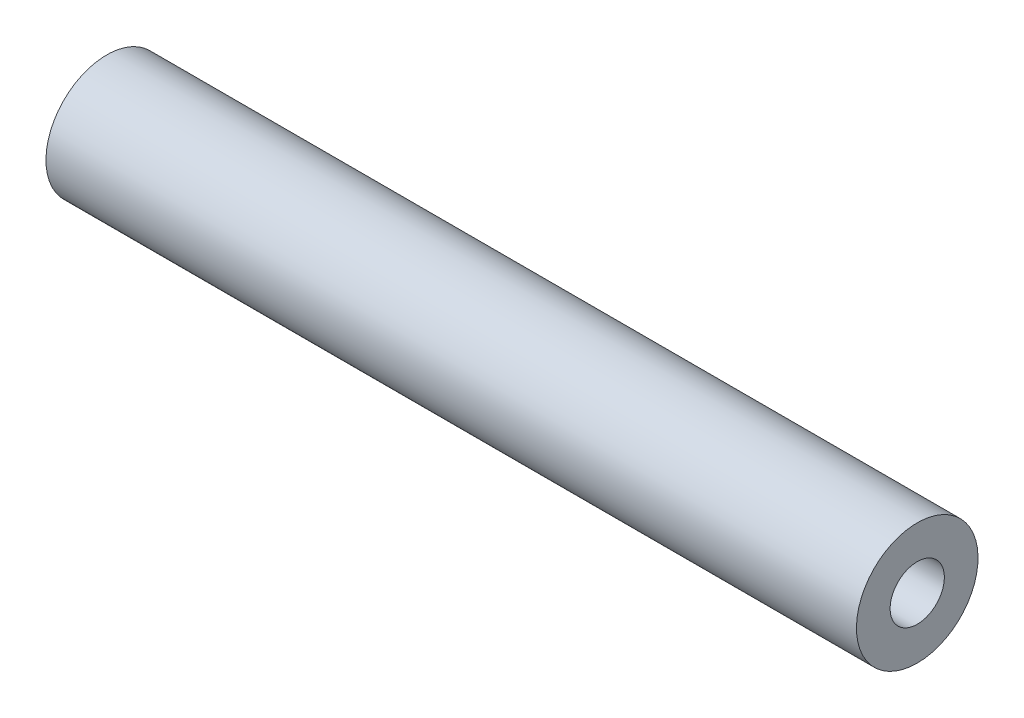
ISO-10303-21;
HEADER;
FILE_DESCRIPTION(('STEP AP214'),'2;1');
FILE_NAME('part.step','',(''),(''),'','','');
FILE_SCHEMA(('AUTOMOTIVE_DESIGN { 1 0 10303 214 1 1 1 1 }'));
ENDSEC;
DATA;
#1=APPLICATION_CONTEXT('core data for automotive mechanical design processes');
#2=APPLICATION_PROTOCOL_DEFINITION('international standard','automotive_design',2000,#1);
#3=PRODUCT_CONTEXT('',#1,'mechanical');
#4=PRODUCT('Part','Part','',(#3));
#5=PRODUCT_RELATED_PRODUCT_CATEGORY('part','',(#4));
#6=PRODUCT_DEFINITION_FORMATION('','',#4);
#7=PRODUCT_DEFINITION_CONTEXT('part definition',#1,'design');
#8=PRODUCT_DEFINITION('design','',#6,#7);
#9=PRODUCT_DEFINITION_SHAPE('','',#8);
#10=(LENGTH_UNIT() NAMED_UNIT(*) SI_UNIT(.MILLI.,.METRE.));
#11=(NAMED_UNIT(*) PLANE_ANGLE_UNIT() SI_UNIT($,.RADIAN.));
#12=(NAMED_UNIT(*) SI_UNIT($,.STERADIAN.) SOLID_ANGLE_UNIT());
#13=UNCERTAINTY_MEASURE_WITH_UNIT(LENGTH_MEASURE(1.E-05),#10,'distance_accuracy_value','');
#14=(GEOMETRIC_REPRESENTATION_CONTEXT(3) GLOBAL_UNCERTAINTY_ASSIGNED_CONTEXT((#13)) GLOBAL_UNIT_ASSIGNED_CONTEXT((#10,
#11,#12)) REPRESENTATION_CONTEXT('',''));
#15=CARTESIAN_POINT('',(0.,0.,0.));
#16=DIRECTION('',(0.,0.,1.));
#17=DIRECTION('',(1.,0.,0.));
#18=AXIS2_PLACEMENT_3D('',#15,#16,#17);
#19=CARTESIAN_POINT('',(0.,0.,0.));
#20=DIRECTION('',(-1.,0.,0.));
#21=DIRECTION('',(0.,-1.,0.));
#22=AXIS2_PLACEMENT_3D('',#19,#20,#21);
#23=PLANE('',#22);
#24=CARTESIAN_POINT('',(0.,3.80999999999999,0.));
#25=DIRECTION('',(-1.,0.,0.));
#26=DIRECTION('',(0.,0.,1.));
#27=AXIS2_PLACEMENT_3D('',#24,#25,#26);
#28=CIRCLE('',#27,1.69999999999999);
#29=CARTESIAN_POINT('',(0.,3.80999999999999,1.69999999999999));
#30=VERTEX_POINT('',#29);
#31=EDGE_CURVE('E58',#30,#30,#28,.T.);
#32=ORIENTED_EDGE('',*,*,#31,.F.);
#33=EDGE_LOOP('',(#32));
#34=FACE_BOUND('',#33,.T.);
#35=CARTESIAN_POINT('',(0.,3.81,0.));
#36=DIRECTION('',(-1.,0.,0.));
#37=DIRECTION('',(0.,-1.,0.));
#38=AXIS2_PLACEMENT_3D('',#35,#36,#37);
#39=CIRCLE('',#38,3.81);
#40=CARTESIAN_POINT('',(0.,0.,0.));
#41=VERTEX_POINT('',#40);
#42=EDGE_CURVE('E11',#41,#41,#39,.T.);
#43=ORIENTED_EDGE('',*,*,#42,.T.);
#44=EDGE_LOOP('',(#43));
#45=FACE_BOUND('',#44,.T.);
#46=ADVANCED_FACE('F35',(#34,#45),#23,.T.);
#47=CARTESIAN_POINT('',(50.8,0.,0.));
#48=DIRECTION('',(1.,0.,0.));
#49=DIRECTION('',(0.,1.,0.));
#50=AXIS2_PLACEMENT_3D('',#47,#48,#49);
#51=PLANE('',#50);
#52=CARTESIAN_POINT('',(50.8,3.80999999999999,0.));
#53=DIRECTION('',(1.,0.,0.));
#54=DIRECTION('',(0.,0.,-1.));
#55=AXIS2_PLACEMENT_3D('',#52,#53,#54);
#56=CIRCLE('',#55,1.69999999999999);
#57=CARTESIAN_POINT('',(50.8,3.80999999999999,-1.69999999999999));
#58=VERTEX_POINT('',#57);
#59=EDGE_CURVE('E59',#58,#58,#56,.T.);
#60=ORIENTED_EDGE('',*,*,#59,.F.);
#61=EDGE_LOOP('',(#60));
#62=FACE_BOUND('',#61,.T.);
#63=CARTESIAN_POINT('',(50.8,3.80999999999999,0.));
#64=DIRECTION('',(-1.,0.,0.));
#65=DIRECTION('',(0.,-1.,0.));
#66=AXIS2_PLACEMENT_3D('',#63,#64,#65);
#67=CIRCLE('',#66,3.80999999999999);
#68=CARTESIAN_POINT('',(50.8,0.,0.));
#69=VERTEX_POINT('',#68);
#70=EDGE_CURVE('E42',#69,#69,#67,.T.);
#71=ORIENTED_EDGE('',*,*,#70,.F.);
#72=EDGE_LOOP('',(#71));
#73=FACE_BOUND('',#72,.T.);
#74=ADVANCED_FACE('F74',(#62,#73),#51,.T.);
#75=CARTESIAN_POINT('',(0.,3.81,0.));
#76=DIRECTION('',(-1.,0.,0.));
#77=DIRECTION('',(0.,-1.,0.));
#78=AXIS2_PLACEMENT_3D('',#75,#76,#77);
#79=CYLINDRICAL_SURFACE('',#78,3.80999999999999);
#80=ORIENTED_EDGE('',*,*,#70,.T.);
#81=EDGE_LOOP('',(#80));
#82=FACE_BOUND('',#81,.T.);
#83=ORIENTED_EDGE('',*,*,#42,.F.);
#84=EDGE_LOOP('',(#83));
#85=FACE_BOUND('',#84,.T.);
#86=ADVANCED_FACE('F71',(#82,#85),#79,.T.);
#87=CARTESIAN_POINT('',(6.35,3.80999999999999,0.));
#88=DIRECTION('',(-1.,0.,0.));
#89=DIRECTION('',(0.,0.,1.));
#90=AXIS2_PLACEMENT_3D('',#87,#88,#89);
#91=CONICAL_SURFACE('',#90,1.7,1.02974425867665);
#92=CARTESIAN_POINT('',(7.37146305234685,3.80999999999999,0.));
#93=VERTEX_POINT('',#92);
#94=VERTEX_LOOP('',#93);
#95=FACE_BOUND('',#94,.T.);
#96=CARTESIAN_POINT('',(6.35,3.80999999999999,0.));
#97=DIRECTION('',(-1.,0.,0.));
#98=DIRECTION('',(0.,0.,1.));
#99=AXIS2_PLACEMENT_3D('',#96,#97,#98);
#100=CIRCLE('',#99,1.7);
#101=CARTESIAN_POINT('',(6.35,3.80999999999999,1.7));
#102=VERTEX_POINT('',#101);
#103=EDGE_CURVE('E62',#102,#102,#100,.T.);
#104=ORIENTED_EDGE('',*,*,#103,.T.);
#105=EDGE_LOOP('',(#104));
#106=FACE_BOUND('',#105,.T.);
#107=ADVANCED_FACE('F81',(#95,#106),#91,.F.);
#108=CARTESIAN_POINT('',(0.,3.80999999999999,0.));
#109=DIRECTION('',(-1.,0.,0.));
#110=DIRECTION('',(0.,0.,1.));
#111=AXIS2_PLACEMENT_3D('',#108,#109,#110);
#112=CYLINDRICAL_SURFACE('',#111,1.69999999999999);
#113=ORIENTED_EDGE('',*,*,#103,.F.);
#114=EDGE_LOOP('',(#113));
#115=FACE_BOUND('',#114,.T.);
#116=ORIENTED_EDGE('',*,*,#31,.T.);
#117=EDGE_LOOP('',(#116));
#118=FACE_BOUND('',#117,.T.);
#119=ADVANCED_FACE('F52',(#115,#118),#112,.F.);
#120=CARTESIAN_POINT('',(44.45,3.80999999999999,0.));
#121=DIRECTION('',(1.,0.,0.));
#122=DIRECTION('',(0.,0.,-1.));
#123=AXIS2_PLACEMENT_3D('',#120,#121,#122);
#124=CONICAL_SURFACE('',#123,1.7,1.02974425867665);
#125=CARTESIAN_POINT('',(43.4285369476531,3.80999999999999,0.));
#126=VERTEX_POINT('',#125);
#127=VERTEX_LOOP('',#126);
#128=FACE_BOUND('',#127,.T.);
#129=CARTESIAN_POINT('',(44.45,3.80999999999999,0.));
#130=DIRECTION('',(1.,0.,0.));
#131=DIRECTION('',(0.,0.,-1.));
#132=AXIS2_PLACEMENT_3D('',#129,#130,#131);
#133=CIRCLE('',#132,1.7);
#134=CARTESIAN_POINT('',(44.45,3.80999999999999,-1.7));
#135=VERTEX_POINT('',#134);
#136=EDGE_CURVE('E56',#135,#135,#133,.T.);
#137=ORIENTED_EDGE('',*,*,#136,.T.);
#138=EDGE_LOOP('',(#137));
#139=FACE_BOUND('',#138,.T.);
#140=ADVANCED_FACE('F48',(#128,#139),#124,.F.);
#141=CARTESIAN_POINT('',(50.8,3.80999999999999,0.));
#142=DIRECTION('',(1.,0.,0.));
#143=DIRECTION('',(0.,0.,-1.));
#144=AXIS2_PLACEMENT_3D('',#141,#142,#143);
#145=CYLINDRICAL_SURFACE('',#144,1.69999999999999);
#146=ORIENTED_EDGE('',*,*,#136,.F.);
#147=EDGE_LOOP('',(#146));
#148=FACE_BOUND('',#147,.T.);
#149=ORIENTED_EDGE('',*,*,#59,.T.);
#150=EDGE_LOOP('',(#149));
#151=FACE_BOUND('',#150,.T.);
#152=ADVANCED_FACE('F51',(#148,#151),#145,.F.);
#153=CLOSED_SHELL('',(#46,#74,#86,#107,#119,#140,#152));
#154=MANIFOLD_SOLID_BREP('B2',#153);
#155=ADVANCED_BREP_SHAPE_REPRESENTATION('',(#18,#154),#14);
#156=SHAPE_DEFINITION_REPRESENTATION(#9,#155);
ENDSEC;
END-ISO-10303-21;
